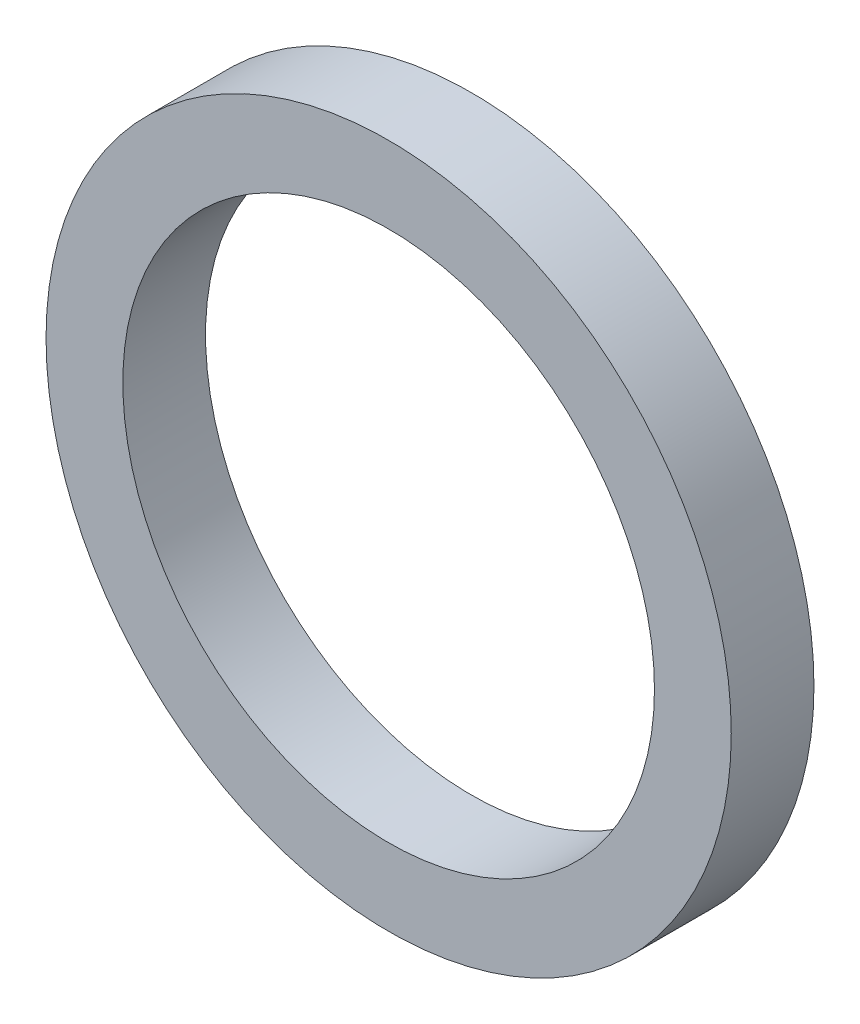
ISO-10303-21;
HEADER;
FILE_DESCRIPTION(('STEP AP214'),'2;1');
FILE_NAME('part.step','',(''),(''),'','','');
FILE_SCHEMA(('AUTOMOTIVE_DESIGN { 1 0 10303 214 1 1 1 1 }'));
ENDSEC;
DATA;
#1=APPLICATION_CONTEXT('core data for automotive mechanical design processes');
#2=APPLICATION_PROTOCOL_DEFINITION('international standard','automotive_design',2000,#1);
#3=PRODUCT_CONTEXT('',#1,'mechanical');
#4=PRODUCT('Part','Part','',(#3));
#5=PRODUCT_RELATED_PRODUCT_CATEGORY('part','',(#4));
#6=PRODUCT_DEFINITION_FORMATION('','',#4);
#7=PRODUCT_DEFINITION_CONTEXT('part definition',#1,'design');
#8=PRODUCT_DEFINITION('design','',#6,#7);
#9=PRODUCT_DEFINITION_SHAPE('','',#8);
#10=(LENGTH_UNIT() NAMED_UNIT(*) SI_UNIT(.MILLI.,.METRE.));
#11=(NAMED_UNIT(*) PLANE_ANGLE_UNIT() SI_UNIT($,.RADIAN.));
#12=(NAMED_UNIT(*) SI_UNIT($,.STERADIAN.) SOLID_ANGLE_UNIT());
#13=UNCERTAINTY_MEASURE_WITH_UNIT(LENGTH_MEASURE(1.E-05),#10,'distance_accuracy_value','');
#14=(GEOMETRIC_REPRESENTATION_CONTEXT(3) GLOBAL_UNCERTAINTY_ASSIGNED_CONTEXT((#13)) GLOBAL_UNIT_ASSIGNED_CONTEXT((#10,
#11,#12)) REPRESENTATION_CONTEXT('',''));
#15=CARTESIAN_POINT('',(0.,0.,0.));
#16=DIRECTION('',(0.,0.,1.));
#17=DIRECTION('',(1.,0.,0.));
#18=AXIS2_PLACEMENT_3D('',#15,#16,#17);
#19=CARTESIAN_POINT('',(0.,0.,7.));
#20=DIRECTION('',(0.,0.,1.));
#21=DIRECTION('',(1.,0.,0.));
#22=AXIS2_PLACEMENT_3D('',#19,#20,#21);
#23=PLANE('',#22);
#24=CARTESIAN_POINT('',(0.,0.,7.));
#25=DIRECTION('',(0.,0.,1.));
#26=DIRECTION('',(1.,0.,0.));
#27=AXIS2_PLACEMENT_3D('',#24,#25,#26);
#28=CIRCLE('',#27,29.);
#29=CARTESIAN_POINT('',(29.,0.,7.));
#30=VERTEX_POINT('',#29);
#31=EDGE_CURVE('E10',#30,#30,#28,.T.);
#32=ORIENTED_EDGE('',*,*,#31,.T.);
#33=EDGE_LOOP('',(#32));
#34=FACE_BOUND('',#33,.T.);
#35=CARTESIAN_POINT('',(0.,0.,7.));
#36=DIRECTION('',(0.,0.,1.));
#37=DIRECTION('',(1.,0.,0.));
#38=AXIS2_PLACEMENT_3D('',#35,#36,#37);
#39=CIRCLE('',#38,22.5);
#40=CARTESIAN_POINT('',(22.5,0.,7.));
#41=VERTEX_POINT('',#40);
#42=EDGE_CURVE('E46',#41,#41,#39,.T.);
#43=ORIENTED_EDGE('',*,*,#42,.F.);
#44=EDGE_LOOP('',(#43));
#45=FACE_BOUND('',#44,.T.);
#46=ADVANCED_FACE('F35',(#34,#45),#23,.T.);
#47=CARTESIAN_POINT('',(0.,0.,0.));
#48=DIRECTION('',(0.,0.,1.));
#49=DIRECTION('',(1.,0.,0.));
#50=AXIS2_PLACEMENT_3D('',#47,#48,#49);
#51=PLANE('',#50);
#52=CARTESIAN_POINT('',(0.,0.,0.));
#53=DIRECTION('',(0.,0.,1.));
#54=DIRECTION('',(1.,0.,0.));
#55=AXIS2_PLACEMENT_3D('',#52,#53,#54);
#56=CIRCLE('',#55,29.);
#57=CARTESIAN_POINT('',(29.,0.,0.));
#58=VERTEX_POINT('',#57);
#59=EDGE_CURVE('E39',#58,#58,#56,.T.);
#60=ORIENTED_EDGE('',*,*,#59,.F.);
#61=EDGE_LOOP('',(#60));
#62=FACE_BOUND('',#61,.T.);
#63=CARTESIAN_POINT('',(0.,0.,0.));
#64=DIRECTION('',(0.,0.,1.));
#65=DIRECTION('',(1.,0.,0.));
#66=AXIS2_PLACEMENT_3D('',#63,#64,#65);
#67=CIRCLE('',#66,22.5);
#68=CARTESIAN_POINT('',(22.5,0.,0.));
#69=VERTEX_POINT('',#68);
#70=EDGE_CURVE('E48',#69,#69,#67,.T.);
#71=ORIENTED_EDGE('',*,*,#70,.T.);
#72=EDGE_LOOP('',(#71));
#73=FACE_BOUND('',#72,.T.);
#74=ADVANCED_FACE('F58',(#62,#73),#51,.F.);
#75=CARTESIAN_POINT('',(0.,0.,7.));
#76=DIRECTION('',(0.,0.,-1.));
#77=DIRECTION('',(-1.,0.,0.));
#78=AXIS2_PLACEMENT_3D('',#75,#76,#77);
#79=CYLINDRICAL_SURFACE('',#78,29.);
#80=ORIENTED_EDGE('',*,*,#31,.F.);
#81=EDGE_LOOP('',(#80));
#82=FACE_BOUND('',#81,.T.);
#83=ORIENTED_EDGE('',*,*,#59,.T.);
#84=EDGE_LOOP('',(#83));
#85=FACE_BOUND('',#84,.T.);
#86=ADVANCED_FACE('F37',(#82,#85),#79,.T.);
#87=CARTESIAN_POINT('',(0.,0.,7.));
#88=DIRECTION('',(0.,0.,-1.));
#89=DIRECTION('',(-1.,0.,0.));
#90=AXIS2_PLACEMENT_3D('',#87,#88,#89);
#91=CYLINDRICAL_SURFACE('',#90,22.5);
#92=ORIENTED_EDGE('',*,*,#42,.T.);
#93=EDGE_LOOP('',(#92));
#94=FACE_BOUND('',#93,.T.);
#95=ORIENTED_EDGE('',*,*,#70,.F.);
#96=EDGE_LOOP('',(#95));
#97=FACE_BOUND('',#96,.T.);
#98=ADVANCED_FACE('F54',(#94,#97),#91,.F.);
#99=CLOSED_SHELL('',(#46,#74,#86,#98));
#100=MANIFOLD_SOLID_BREP('B2',#99);
#101=ADVANCED_BREP_SHAPE_REPRESENTATION('',(#18,#100),#14);
#102=SHAPE_DEFINITION_REPRESENTATION(#9,#101);
ENDSEC;
END-ISO-10303-21;
